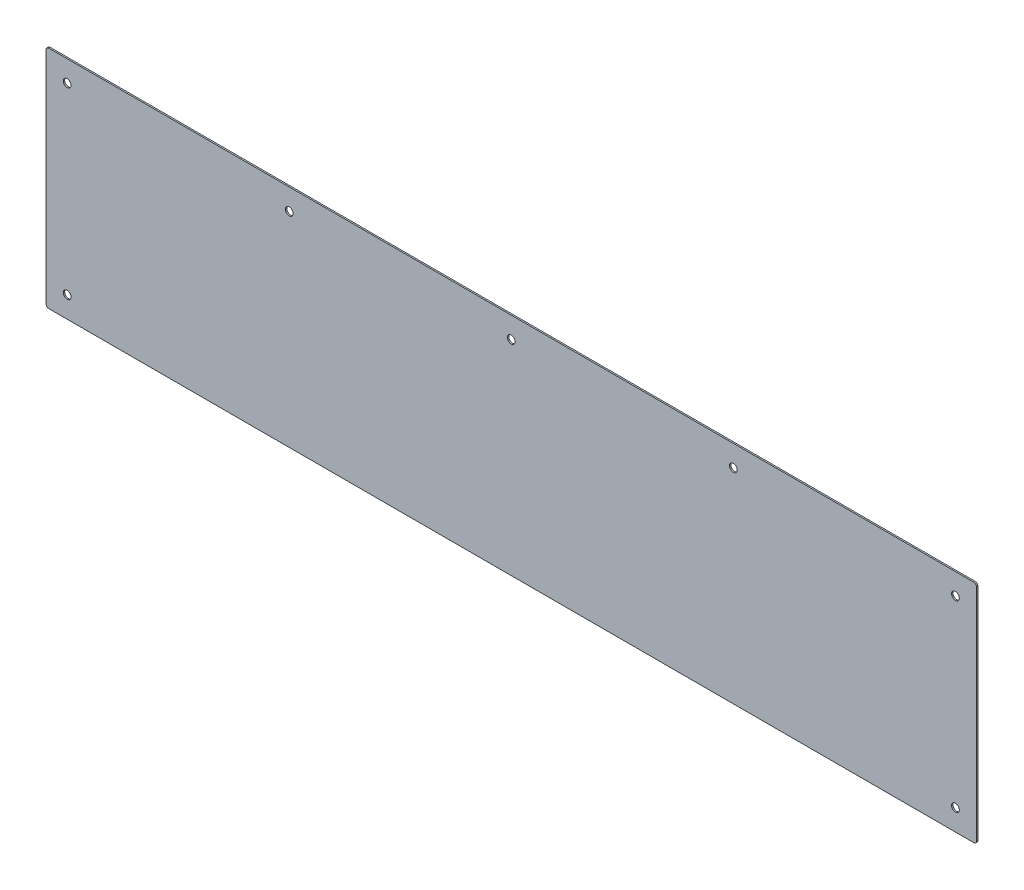
ISO-10303-21;
HEADER;
FILE_DESCRIPTION(('STEP AP214'),'2;1');
FILE_NAME('part.step','',(''),(''),'','','');
FILE_SCHEMA(('AUTOMOTIVE_DESIGN { 1 0 10303 214 1 1 1 1 }'));
ENDSEC;
DATA;
#1=APPLICATION_CONTEXT('core data for automotive mechanical design processes');
#2=APPLICATION_PROTOCOL_DEFINITION('international standard','automotive_design',2000,#1);
#3=PRODUCT_CONTEXT('',#1,'mechanical');
#4=PRODUCT('Part','Part','',(#3));
#5=PRODUCT_RELATED_PRODUCT_CATEGORY('part','',(#4));
#6=PRODUCT_DEFINITION_FORMATION('','',#4);
#7=PRODUCT_DEFINITION_CONTEXT('part definition',#1,'design');
#8=PRODUCT_DEFINITION('design','',#6,#7);
#9=PRODUCT_DEFINITION_SHAPE('','',#8);
#10=(LENGTH_UNIT() NAMED_UNIT(*) SI_UNIT(.MILLI.,.METRE.));
#11=(NAMED_UNIT(*) PLANE_ANGLE_UNIT() SI_UNIT($,.RADIAN.));
#12=(NAMED_UNIT(*) SI_UNIT($,.STERADIAN.) SOLID_ANGLE_UNIT());
#13=UNCERTAINTY_MEASURE_WITH_UNIT(LENGTH_MEASURE(1.E-05),#10,'distance_accuracy_value','');
#14=(GEOMETRIC_REPRESENTATION_CONTEXT(3) GLOBAL_UNCERTAINTY_ASSIGNED_CONTEXT((#13)) GLOBAL_UNIT_ASSIGNED_CONTEXT((#10,
#11,#12)) REPRESENTATION_CONTEXT('',''));
#15=CARTESIAN_POINT('',(0.,0.,0.));
#16=DIRECTION('',(0.,0.,1.));
#17=DIRECTION('',(1.,0.,0.));
#18=AXIS2_PLACEMENT_3D('',#15,#16,#17);
#19=CARTESIAN_POINT('',(-330.,-80.,-1.));
#20=DIRECTION('',(-1.,0.,0.));
#21=DIRECTION('',(0.,0.,1.));
#22=AXIS2_PLACEMENT_3D('',#19,#20,#21);
#23=PLANE('',#22);
#24=DIRECTION('',(0.,-1.,0.));
#25=VECTOR('',#24,1.);
#26=CARTESIAN_POINT('',(-330.,-80.,-1.));
#27=LINE('',#26,#25);
#28=CARTESIAN_POINT('',(-330.,78.,-1.));
#29=VERTEX_POINT('',#28);
#30=CARTESIAN_POINT('',(-330.,-78.,-1.));
#31=VERTEX_POINT('',#30);
#32=EDGE_CURVE('E187',#29,#31,#27,.T.);
#33=ORIENTED_EDGE('',*,*,#32,.T.);
#34=DIRECTION('',(0.,0.,1.));
#35=VECTOR('',#34,1.);
#36=CARTESIAN_POINT('',(-330.,-78.,-1.));
#37=LINE('',#36,#35);
#38=CARTESIAN_POINT('',(-330.,-78.,0.));
#39=VERTEX_POINT('',#38);
#40=EDGE_CURVE('E11',#31,#39,#37,.T.);
#41=ORIENTED_EDGE('',*,*,#40,.T.);
#42=DIRECTION('',(0.,-1.,0.));
#43=VECTOR('',#42,1.);
#44=CARTESIAN_POINT('',(-330.,-80.,0.));
#45=LINE('',#44,#43);
#46=CARTESIAN_POINT('',(-330.,78.,0.));
#47=VERTEX_POINT('',#46);
#48=EDGE_CURVE('E118',#47,#39,#45,.T.);
#49=ORIENTED_EDGE('',*,*,#48,.F.);
#50=DIRECTION('',(0.,0.,1.));
#51=VECTOR('',#50,1.);
#52=CARTESIAN_POINT('',(-330.,78.,-1.));
#53=LINE('',#52,#51);
#54=EDGE_CURVE('E54',#47,#29,#53,.F.);
#55=ORIENTED_EDGE('',*,*,#54,.T.);
#56=EDGE_LOOP('',(#33,#41,#49,#55));
#57=FACE_BOUND('',#56,.T.);
#58=ADVANCED_FACE('F45',(#57),#23,.T.);
#59=CARTESIAN_POINT('',(330.,80.,-1.));
#60=DIRECTION('',(0.,1.,0.));
#61=DIRECTION('',(-1.,0.,0.));
#62=AXIS2_PLACEMENT_3D('',#59,#60,#61);
#63=PLANE('',#62);
#64=DIRECTION('',(-1.,0.,0.));
#65=VECTOR('',#64,1.);
#66=CARTESIAN_POINT('',(330.,80.,0.));
#67=LINE('',#66,#65);
#68=CARTESIAN_POINT('',(328.,80.,0.));
#69=VERTEX_POINT('',#68);
#70=CARTESIAN_POINT('',(-328.,80.,0.));
#71=VERTEX_POINT('',#70);
#72=EDGE_CURVE('E151',#69,#71,#67,.T.);
#73=ORIENTED_EDGE('',*,*,#72,.F.);
#74=DIRECTION('',(0.,0.,1.));
#75=VECTOR('',#74,1.);
#76=CARTESIAN_POINT('',(328.,80.,-1.));
#77=LINE('',#76,#75);
#78=CARTESIAN_POINT('',(328.,80.,-1.));
#79=VERTEX_POINT('',#78);
#80=EDGE_CURVE('E68',#69,#79,#77,.F.);
#81=ORIENTED_EDGE('',*,*,#80,.T.);
#82=DIRECTION('',(-1.,0.,0.));
#83=VECTOR('',#82,1.);
#84=CARTESIAN_POINT('',(330.,80.,-1.));
#85=LINE('',#84,#83);
#86=CARTESIAN_POINT('',(-328.,80.,-1.));
#87=VERTEX_POINT('',#86);
#88=EDGE_CURVE('E141',#79,#87,#85,.T.);
#89=ORIENTED_EDGE('',*,*,#88,.T.);
#90=DIRECTION('',(0.,0.,1.));
#91=VECTOR('',#90,1.);
#92=CARTESIAN_POINT('',(-328.,80.,-1.));
#93=LINE('',#92,#91);
#94=EDGE_CURVE('E177',#87,#71,#93,.T.);
#95=ORIENTED_EDGE('',*,*,#94,.T.);
#96=EDGE_LOOP('',(#73,#81,#89,#95));
#97=FACE_BOUND('',#96,.T.);
#98=ADVANCED_FACE('F196',(#97),#63,.T.);
#99=CARTESIAN_POINT('',(330.,-80.,-1.));
#100=DIRECTION('',(1.,0.,0.));
#101=DIRECTION('',(0.,0.,-1.));
#102=AXIS2_PLACEMENT_3D('',#99,#100,#101);
#103=PLANE('',#102);
#104=DIRECTION('',(0.,1.,0.));
#105=VECTOR('',#104,1.);
#106=CARTESIAN_POINT('',(330.,-80.,0.));
#107=LINE('',#106,#105);
#108=CARTESIAN_POINT('',(330.,-78.,0.));
#109=VERTEX_POINT('',#108);
#110=CARTESIAN_POINT('',(330.,78.,0.));
#111=VERTEX_POINT('',#110);
#112=EDGE_CURVE('E135',#109,#111,#107,.T.);
#113=ORIENTED_EDGE('',*,*,#112,.F.);
#114=DIRECTION('',(0.,0.,1.));
#115=VECTOR('',#114,1.);
#116=CARTESIAN_POINT('',(330.,-78.,-1.));
#117=LINE('',#116,#115);
#118=CARTESIAN_POINT('',(330.,-78.,-1.));
#119=VERTEX_POINT('',#118);
#120=EDGE_CURVE('E165',#109,#119,#117,.F.);
#121=ORIENTED_EDGE('',*,*,#120,.T.);
#122=DIRECTION('',(0.,1.,0.));
#123=VECTOR('',#122,1.);
#124=CARTESIAN_POINT('',(330.,-80.,-1.));
#125=LINE('',#124,#123);
#126=CARTESIAN_POINT('',(330.,78.,-1.));
#127=VERTEX_POINT('',#126);
#128=EDGE_CURVE('E148',#119,#127,#125,.T.);
#129=ORIENTED_EDGE('',*,*,#128,.T.);
#130=DIRECTION('',(0.,0.,1.));
#131=VECTOR('',#130,1.);
#132=CARTESIAN_POINT('',(330.,78.,-1.));
#133=LINE('',#132,#131);
#134=EDGE_CURVE('E161',#127,#111,#133,.T.);
#135=ORIENTED_EDGE('',*,*,#134,.T.);
#136=EDGE_LOOP('',(#113,#121,#129,#135));
#137=FACE_BOUND('',#136,.T.);
#138=ADVANCED_FACE('F304',(#137),#103,.T.);
#139=CARTESIAN_POINT('',(330.,-80.,-1.));
#140=DIRECTION('',(0.,-1.,0.));
#141=DIRECTION('',(1.,0.,0.));
#142=AXIS2_PLACEMENT_3D('',#139,#140,#141);
#143=PLANE('',#142);
#144=DIRECTION('',(1.,0.,0.));
#145=VECTOR('',#144,1.);
#146=CARTESIAN_POINT('',(330.,-80.,-1.));
#147=LINE('',#146,#145);
#148=CARTESIAN_POINT('',(-328.,-80.,-1.));
#149=VERTEX_POINT('',#148);
#150=CARTESIAN_POINT('',(328.,-80.,-1.));
#151=VERTEX_POINT('',#150);
#152=EDGE_CURVE('E192',#149,#151,#147,.T.);
#153=ORIENTED_EDGE('',*,*,#152,.T.);
#154=DIRECTION('',(0.,0.,1.));
#155=VECTOR('',#154,1.);
#156=CARTESIAN_POINT('',(328.,-80.,-1.));
#157=LINE('',#156,#155);
#158=CARTESIAN_POINT('',(328.,-80.,0.));
#159=VERTEX_POINT('',#158);
#160=EDGE_CURVE('E133',#151,#159,#157,.T.);
#161=ORIENTED_EDGE('',*,*,#160,.T.);
#162=DIRECTION('',(1.,0.,0.));
#163=VECTOR('',#162,1.);
#164=CARTESIAN_POINT('',(330.,-80.,0.));
#165=LINE('',#164,#163);
#166=CARTESIAN_POINT('',(-328.,-80.,0.));
#167=VERTEX_POINT('',#166);
#168=EDGE_CURVE('E116',#167,#159,#165,.T.);
#169=ORIENTED_EDGE('',*,*,#168,.F.);
#170=DIRECTION('',(0.,0.,1.));
#171=VECTOR('',#170,1.);
#172=CARTESIAN_POINT('',(-328.,-80.,-1.));
#173=LINE('',#172,#171);
#174=EDGE_CURVE('E130',#167,#149,#173,.F.);
#175=ORIENTED_EDGE('',*,*,#174,.T.);
#176=EDGE_LOOP('',(#153,#161,#169,#175));
#177=FACE_BOUND('',#176,.T.);
#178=ADVANCED_FACE('F129',(#177),#143,.T.);
#179=CARTESIAN_POINT('',(0.,0.,-1.));
#180=DIRECTION('',(0.,0.,1.));
#181=DIRECTION('',(1.,0.,0.));
#182=AXIS2_PLACEMENT_3D('',#179,#180,#181);
#183=PLANE('',#182);
#184=CARTESIAN_POINT('',(-315.,64.9999999999999,-1.));
#185=DIRECTION('',(0.,0.,1.));
#186=DIRECTION('',(1.,0.,0.));
#187=AXIS2_PLACEMENT_3D('',#184,#185,#186);
#188=CIRCLE('',#187,2.74999999999997);
#189=CARTESIAN_POINT('',(-312.25,64.9999999999999,-1.));
#190=VERTEX_POINT('',#189);
#191=EDGE_CURVE('E259',#190,#190,#188,.T.);
#192=ORIENTED_EDGE('',*,*,#191,.T.);
#193=EDGE_LOOP('',(#192));
#194=FACE_BOUND('',#193,.T.);
#195=CARTESIAN_POINT('',(-315.,-64.9999999999999,-1.));
#196=DIRECTION('',(0.,0.,1.));
#197=DIRECTION('',(1.,0.,0.));
#198=AXIS2_PLACEMENT_3D('',#195,#196,#197);
#199=CIRCLE('',#198,2.74999999999997);
#200=CARTESIAN_POINT('',(-312.25,-64.9999999999999,-1.));
#201=VERTEX_POINT('',#200);
#202=EDGE_CURVE('E251',#201,#201,#199,.T.);
#203=ORIENTED_EDGE('',*,*,#202,.T.);
#204=EDGE_LOOP('',(#203));
#205=FACE_BOUND('',#204,.T.);
#206=CARTESIAN_POINT('',(315.,-64.9999999999999,-1.));
#207=DIRECTION('',(0.,0.,1.));
#208=DIRECTION('',(1.,0.,0.));
#209=AXIS2_PLACEMENT_3D('',#206,#207,#208);
#210=CIRCLE('',#209,2.74999999999997);
#211=CARTESIAN_POINT('',(317.75,-64.9999999999999,-1.));
#212=VERTEX_POINT('',#211);
#213=EDGE_CURVE('E243',#212,#212,#210,.T.);
#214=ORIENTED_EDGE('',*,*,#213,.T.);
#215=EDGE_LOOP('',(#214));
#216=FACE_BOUND('',#215,.T.);
#217=CARTESIAN_POINT('',(315.,64.9999999999999,-1.));
#218=DIRECTION('',(0.,0.,1.));
#219=DIRECTION('',(1.,0.,0.));
#220=AXIS2_PLACEMENT_3D('',#217,#218,#219);
#221=CIRCLE('',#220,2.74999999999997);
#222=CARTESIAN_POINT('',(317.75,64.9999999999999,-1.));
#223=VERTEX_POINT('',#222);
#224=EDGE_CURVE('E235',#223,#223,#221,.T.);
#225=ORIENTED_EDGE('',*,*,#224,.T.);
#226=EDGE_LOOP('',(#225));
#227=FACE_BOUND('',#226,.T.);
#228=CARTESIAN_POINT('',(-157.5,64.9999999999999,-1.));
#229=DIRECTION('',(0.,0.,1.));
#230=DIRECTION('',(1.,0.,0.));
#231=AXIS2_PLACEMENT_3D('',#228,#229,#230);
#232=CIRCLE('',#231,2.75);
#233=CARTESIAN_POINT('',(-154.75,64.9999999999999,-1.));
#234=VERTEX_POINT('',#233);
#235=EDGE_CURVE('E227',#234,#234,#232,.T.);
#236=ORIENTED_EDGE('',*,*,#235,.T.);
#237=EDGE_LOOP('',(#236));
#238=FACE_BOUND('',#237,.T.);
#239=CARTESIAN_POINT('',(157.5,64.9999999999999,-1.));
#240=DIRECTION('',(0.,0.,1.));
#241=DIRECTION('',(1.,0.,0.));
#242=AXIS2_PLACEMENT_3D('',#239,#240,#241);
#243=CIRCLE('',#242,2.75);
#244=CARTESIAN_POINT('',(160.25,64.9999999999999,-1.));
#245=VERTEX_POINT('',#244);
#246=EDGE_CURVE('E219',#245,#245,#243,.T.);
#247=ORIENTED_EDGE('',*,*,#246,.T.);
#248=EDGE_LOOP('',(#247));
#249=FACE_BOUND('',#248,.T.);
#250=CARTESIAN_POINT('',(0.,64.9999999999999,-1.));
#251=DIRECTION('',(0.,0.,1.));
#252=DIRECTION('',(1.,0.,0.));
#253=AXIS2_PLACEMENT_3D('',#250,#251,#252);
#254=CIRCLE('',#253,2.75);
#255=CARTESIAN_POINT('',(2.75,64.9999999999999,-1.));
#256=VERTEX_POINT('',#255);
#257=EDGE_CURVE('E206',#256,#256,#254,.T.);
#258=ORIENTED_EDGE('',*,*,#257,.T.);
#259=EDGE_LOOP('',(#258));
#260=FACE_BOUND('',#259,.T.);
#261=ORIENTED_EDGE('',*,*,#128,.F.);
#262=CARTESIAN_POINT('',(328.,-78.,-1.));
#263=DIRECTION('',(0.,0.,1.));
#264=DIRECTION('',(1.,0.,0.));
#265=AXIS2_PLACEMENT_3D('',#262,#263,#264);
#266=CIRCLE('',#265,2.);
#267=EDGE_CURVE('E174',#119,#151,#266,.F.);
#268=ORIENTED_EDGE('',*,*,#267,.T.);
#269=ORIENTED_EDGE('',*,*,#152,.F.);
#270=CARTESIAN_POINT('',(-328.,-78.,-1.));
#271=DIRECTION('',(0.,0.,1.));
#272=DIRECTION('',(1.,0.,0.));
#273=AXIS2_PLACEMENT_3D('',#270,#271,#272);
#274=CIRCLE('',#273,2.);
#275=EDGE_CURVE('E139',#149,#31,#274,.F.);
#276=ORIENTED_EDGE('',*,*,#275,.T.);
#277=ORIENTED_EDGE('',*,*,#32,.F.);
#278=CARTESIAN_POINT('',(-328.,78.,-1.));
#279=DIRECTION('',(0.,0.,1.));
#280=DIRECTION('',(1.,0.,0.));
#281=AXIS2_PLACEMENT_3D('',#278,#279,#280);
#282=CIRCLE('',#281,2.);
#283=EDGE_CURVE('E61',#29,#87,#282,.F.);
#284=ORIENTED_EDGE('',*,*,#283,.T.);
#285=ORIENTED_EDGE('',*,*,#88,.F.);
#286=CARTESIAN_POINT('',(328.,78.,-1.));
#287=DIRECTION('',(0.,0.,1.));
#288=DIRECTION('',(1.,0.,0.));
#289=AXIS2_PLACEMENT_3D('',#286,#287,#288);
#290=CIRCLE('',#289,2.);
#291=EDGE_CURVE('E171',#79,#127,#290,.F.);
#292=ORIENTED_EDGE('',*,*,#291,.T.);
#293=EDGE_LOOP('',(#261,#268,#269,#276,#277,#284,#285,#292));
#294=FACE_BOUND('',#293,.T.);
#295=ADVANCED_FACE('F190',(#194,#205,#216,#227,#238,#249,#260,#294),#183,.F.);
#296=CARTESIAN_POINT('',(0.,0.,0.));
#297=DIRECTION('',(0.,0.,1.));
#298=DIRECTION('',(1.,0.,0.));
#299=AXIS2_PLACEMENT_3D('',#296,#297,#298);
#300=PLANE('',#299);
#301=CARTESIAN_POINT('',(-315.,64.9999999999999,0.));
#302=DIRECTION('',(0.,0.,1.));
#303=DIRECTION('',(1.,0.,0.));
#304=AXIS2_PLACEMENT_3D('',#301,#302,#303);
#305=CIRCLE('',#304,2.74999999999997);
#306=CARTESIAN_POINT('',(-312.25,64.9999999999999,0.));
#307=VERTEX_POINT('',#306);
#308=EDGE_CURVE('E263',#307,#307,#305,.T.);
#309=ORIENTED_EDGE('',*,*,#308,.F.);
#310=EDGE_LOOP('',(#309));
#311=FACE_BOUND('',#310,.T.);
#312=CARTESIAN_POINT('',(-315.,-64.9999999999999,0.));
#313=DIRECTION('',(0.,0.,1.));
#314=DIRECTION('',(1.,0.,0.));
#315=AXIS2_PLACEMENT_3D('',#312,#313,#314);
#316=CIRCLE('',#315,2.74999999999997);
#317=CARTESIAN_POINT('',(-312.25,-64.9999999999999,0.));
#318=VERTEX_POINT('',#317);
#319=EDGE_CURVE('E255',#318,#318,#316,.T.);
#320=ORIENTED_EDGE('',*,*,#319,.F.);
#321=EDGE_LOOP('',(#320));
#322=FACE_BOUND('',#321,.T.);
#323=CARTESIAN_POINT('',(315.,-64.9999999999999,0.));
#324=DIRECTION('',(0.,0.,1.));
#325=DIRECTION('',(1.,0.,0.));
#326=AXIS2_PLACEMENT_3D('',#323,#324,#325);
#327=CIRCLE('',#326,2.74999999999997);
#328=CARTESIAN_POINT('',(317.75,-64.9999999999999,0.));
#329=VERTEX_POINT('',#328);
#330=EDGE_CURVE('E247',#329,#329,#327,.T.);
#331=ORIENTED_EDGE('',*,*,#330,.F.);
#332=EDGE_LOOP('',(#331));
#333=FACE_BOUND('',#332,.T.);
#334=CARTESIAN_POINT('',(315.,64.9999999999999,0.));
#335=DIRECTION('',(0.,0.,1.));
#336=DIRECTION('',(1.,0.,0.));
#337=AXIS2_PLACEMENT_3D('',#334,#335,#336);
#338=CIRCLE('',#337,2.74999999999997);
#339=CARTESIAN_POINT('',(317.75,64.9999999999999,0.));
#340=VERTEX_POINT('',#339);
#341=EDGE_CURVE('E239',#340,#340,#338,.T.);
#342=ORIENTED_EDGE('',*,*,#341,.F.);
#343=EDGE_LOOP('',(#342));
#344=FACE_BOUND('',#343,.T.);
#345=CARTESIAN_POINT('',(-157.5,64.9999999999999,0.));
#346=DIRECTION('',(0.,0.,1.));
#347=DIRECTION('',(1.,0.,0.));
#348=AXIS2_PLACEMENT_3D('',#345,#346,#347);
#349=CIRCLE('',#348,2.75);
#350=CARTESIAN_POINT('',(-154.75,64.9999999999999,0.));
#351=VERTEX_POINT('',#350);
#352=EDGE_CURVE('E231',#351,#351,#349,.T.);
#353=ORIENTED_EDGE('',*,*,#352,.F.);
#354=EDGE_LOOP('',(#353));
#355=FACE_BOUND('',#354,.T.);
#356=CARTESIAN_POINT('',(157.5,64.9999999999999,0.));
#357=DIRECTION('',(0.,0.,1.));
#358=DIRECTION('',(1.,0.,0.));
#359=AXIS2_PLACEMENT_3D('',#356,#357,#358);
#360=CIRCLE('',#359,2.75);
#361=CARTESIAN_POINT('',(160.25,64.9999999999999,0.));
#362=VERTEX_POINT('',#361);
#363=EDGE_CURVE('E223',#362,#362,#360,.T.);
#364=ORIENTED_EDGE('',*,*,#363,.F.);
#365=EDGE_LOOP('',(#364));
#366=FACE_BOUND('',#365,.T.);
#367=CARTESIAN_POINT('',(0.,64.9999999999999,0.));
#368=DIRECTION('',(0.,0.,1.));
#369=DIRECTION('',(1.,0.,0.));
#370=AXIS2_PLACEMENT_3D('',#367,#368,#369);
#371=CIRCLE('',#370,2.75);
#372=CARTESIAN_POINT('',(2.75,64.9999999999999,0.));
#373=VERTEX_POINT('',#372);
#374=EDGE_CURVE('E215',#373,#373,#371,.T.);
#375=ORIENTED_EDGE('',*,*,#374,.F.);
#376=EDGE_LOOP('',(#375));
#377=FACE_BOUND('',#376,.T.);
#378=ORIENTED_EDGE('',*,*,#168,.T.);
#379=CARTESIAN_POINT('',(328.,-78.,0.));
#380=DIRECTION('',(0.,0.,1.));
#381=DIRECTION('',(1.,0.,0.));
#382=AXIS2_PLACEMENT_3D('',#379,#380,#381);
#383=CIRCLE('',#382,2.);
#384=EDGE_CURVE('E158',#159,#109,#383,.T.);
#385=ORIENTED_EDGE('',*,*,#384,.T.);
#386=ORIENTED_EDGE('',*,*,#112,.T.);
#387=CARTESIAN_POINT('',(328.,78.,0.));
#388=DIRECTION('',(0.,0.,1.));
#389=DIRECTION('',(1.,0.,0.));
#390=AXIS2_PLACEMENT_3D('',#387,#388,#389);
#391=CIRCLE('',#390,2.);
#392=EDGE_CURVE('E123',#111,#69,#391,.T.);
#393=ORIENTED_EDGE('',*,*,#392,.T.);
#394=ORIENTED_EDGE('',*,*,#72,.T.);
#395=CARTESIAN_POINT('',(-328.,78.,0.));
#396=DIRECTION('',(0.,0.,1.));
#397=DIRECTION('',(1.,0.,0.));
#398=AXIS2_PLACEMENT_3D('',#395,#396,#397);
#399=CIRCLE('',#398,2.);
#400=EDGE_CURVE('E124',#71,#47,#399,.T.);
#401=ORIENTED_EDGE('',*,*,#400,.T.);
#402=ORIENTED_EDGE('',*,*,#48,.T.);
#403=CARTESIAN_POINT('',(-328.,-78.,0.));
#404=DIRECTION('',(0.,0.,1.));
#405=DIRECTION('',(1.,0.,0.));
#406=AXIS2_PLACEMENT_3D('',#403,#404,#405);
#407=CIRCLE('',#406,2.);
#408=EDGE_CURVE('E113',#39,#167,#407,.T.);
#409=ORIENTED_EDGE('',*,*,#408,.T.);
#410=EDGE_LOOP('',(#378,#385,#386,#393,#394,#401,#402,#409));
#411=FACE_BOUND('',#410,.T.);
#412=ADVANCED_FACE('F115',(#311,#322,#333,#344,#355,#366,#377,#411),#300,.T.);
#413=CARTESIAN_POINT('',(0.,64.9999999999999,0.));
#414=DIRECTION('',(0.,0.,1.));
#415=DIRECTION('',(1.,0.,0.));
#416=AXIS2_PLACEMENT_3D('',#413,#414,#415);
#417=CYLINDRICAL_SURFACE('',#416,2.75);
#418=ORIENTED_EDGE('',*,*,#257,.F.);
#419=EDGE_LOOP('',(#418));
#420=FACE_BOUND('',#419,.T.);
#421=ORIENTED_EDGE('',*,*,#374,.T.);
#422=EDGE_LOOP('',(#421));
#423=FACE_BOUND('',#422,.T.);
#424=ADVANCED_FACE('F273',(#420,#423),#417,.F.);
#425=CARTESIAN_POINT('',(157.5,64.9999999999999,0.));
#426=DIRECTION('',(0.,0.,1.));
#427=DIRECTION('',(1.,0.,0.));
#428=AXIS2_PLACEMENT_3D('',#425,#426,#427);
#429=CYLINDRICAL_SURFACE('',#428,2.75);
#430=ORIENTED_EDGE('',*,*,#246,.F.);
#431=EDGE_LOOP('',(#430));
#432=FACE_BOUND('',#431,.T.);
#433=ORIENTED_EDGE('',*,*,#363,.T.);
#434=EDGE_LOOP('',(#433));
#435=FACE_BOUND('',#434,.T.);
#436=ADVANCED_FACE('F288',(#432,#435),#429,.F.);
#437=CARTESIAN_POINT('',(-157.5,64.9999999999999,0.));
#438=DIRECTION('',(0.,0.,1.));
#439=DIRECTION('',(1.,0.,0.));
#440=AXIS2_PLACEMENT_3D('',#437,#438,#439);
#441=CYLINDRICAL_SURFACE('',#440,2.75);
#442=ORIENTED_EDGE('',*,*,#235,.F.);
#443=EDGE_LOOP('',(#442));
#444=FACE_BOUND('',#443,.T.);
#445=ORIENTED_EDGE('',*,*,#352,.T.);
#446=EDGE_LOOP('',(#445));
#447=FACE_BOUND('',#446,.T.);
#448=ADVANCED_FACE('F294',(#444,#447),#441,.F.);
#449=CARTESIAN_POINT('',(315.,64.9999999999999,0.));
#450=DIRECTION('',(0.,0.,1.));
#451=DIRECTION('',(1.,0.,0.));
#452=AXIS2_PLACEMENT_3D('',#449,#450,#451);
#453=CYLINDRICAL_SURFACE('',#452,2.74999999999997);
#454=ORIENTED_EDGE('',*,*,#224,.F.);
#455=EDGE_LOOP('',(#454));
#456=FACE_BOUND('',#455,.T.);
#457=ORIENTED_EDGE('',*,*,#341,.T.);
#458=EDGE_LOOP('',(#457));
#459=FACE_BOUND('',#458,.T.);
#460=ADVANCED_FACE('F419',(#456,#459),#453,.F.);
#461=CARTESIAN_POINT('',(315.,-64.9999999999999,0.));
#462=DIRECTION('',(0.,0.,1.));
#463=DIRECTION('',(1.,0.,0.));
#464=AXIS2_PLACEMENT_3D('',#461,#462,#463);
#465=CYLINDRICAL_SURFACE('',#464,2.74999999999997);
#466=ORIENTED_EDGE('',*,*,#213,.F.);
#467=EDGE_LOOP('',(#466));
#468=FACE_BOUND('',#467,.T.);
#469=ORIENTED_EDGE('',*,*,#330,.T.);
#470=EDGE_LOOP('',(#469));
#471=FACE_BOUND('',#470,.T.);
#472=ADVANCED_FACE('F408',(#468,#471),#465,.F.);
#473=CARTESIAN_POINT('',(-315.,-64.9999999999999,0.));
#474=DIRECTION('',(0.,0.,1.));
#475=DIRECTION('',(1.,0.,0.));
#476=AXIS2_PLACEMENT_3D('',#473,#474,#475);
#477=CYLINDRICAL_SURFACE('',#476,2.74999999999997);
#478=ORIENTED_EDGE('',*,*,#202,.F.);
#479=EDGE_LOOP('',(#478));
#480=FACE_BOUND('',#479,.T.);
#481=ORIENTED_EDGE('',*,*,#319,.T.);
#482=EDGE_LOOP('',(#481));
#483=FACE_BOUND('',#482,.T.);
#484=ADVANCED_FACE('F397',(#480,#483),#477,.F.);
#485=CARTESIAN_POINT('',(-315.,64.9999999999999,0.));
#486=DIRECTION('',(0.,0.,1.));
#487=DIRECTION('',(1.,0.,0.));
#488=AXIS2_PLACEMENT_3D('',#485,#486,#487);
#489=CYLINDRICAL_SURFACE('',#488,2.74999999999997);
#490=ORIENTED_EDGE('',*,*,#191,.F.);
#491=EDGE_LOOP('',(#490));
#492=FACE_BOUND('',#491,.T.);
#493=ORIENTED_EDGE('',*,*,#308,.T.);
#494=EDGE_LOOP('',(#493));
#495=FACE_BOUND('',#494,.T.);
#496=ADVANCED_FACE('F269',(#492,#495),#489,.F.);
#497=CARTESIAN_POINT('',(328.,-78.,-1.));
#498=DIRECTION('',(0.,0.,1.));
#499=DIRECTION('',(1.,0.,0.));
#500=AXIS2_PLACEMENT_3D('',#497,#498,#499);
#501=CYLINDRICAL_SURFACE('',#500,2.);
#502=ORIENTED_EDGE('',*,*,#267,.F.);
#503=ORIENTED_EDGE('',*,*,#120,.F.);
#504=ORIENTED_EDGE('',*,*,#384,.F.);
#505=ORIENTED_EDGE('',*,*,#160,.F.);
#506=EDGE_LOOP('',(#502,#503,#504,#505));
#507=FACE_BOUND('',#506,.T.);
#508=ADVANCED_FACE('F309',(#507),#501,.T.);
#509=CARTESIAN_POINT('',(328.,78.,-1.));
#510=DIRECTION('',(0.,0.,1.));
#511=DIRECTION('',(1.,0.,0.));
#512=AXIS2_PLACEMENT_3D('',#509,#510,#511);
#513=CYLINDRICAL_SURFACE('',#512,2.);
#514=ORIENTED_EDGE('',*,*,#291,.F.);
#515=ORIENTED_EDGE('',*,*,#80,.F.);
#516=ORIENTED_EDGE('',*,*,#392,.F.);
#517=ORIENTED_EDGE('',*,*,#134,.F.);
#518=EDGE_LOOP('',(#514,#515,#516,#517));
#519=FACE_BOUND('',#518,.T.);
#520=ADVANCED_FACE('F312',(#519),#513,.T.);
#521=CARTESIAN_POINT('',(-328.,-78.,-1.));
#522=DIRECTION('',(0.,0.,1.));
#523=DIRECTION('',(1.,0.,0.));
#524=AXIS2_PLACEMENT_3D('',#521,#522,#523);
#525=CYLINDRICAL_SURFACE('',#524,2.);
#526=ORIENTED_EDGE('',*,*,#275,.F.);
#527=ORIENTED_EDGE('',*,*,#174,.F.);
#528=ORIENTED_EDGE('',*,*,#408,.F.);
#529=ORIENTED_EDGE('',*,*,#40,.F.);
#530=EDGE_LOOP('',(#526,#527,#528,#529));
#531=FACE_BOUND('',#530,.T.);
#532=ADVANCED_FACE('F138',(#531),#525,.T.);
#533=CARTESIAN_POINT('',(-328.,78.,-1.));
#534=DIRECTION('',(0.,0.,1.));
#535=DIRECTION('',(1.,0.,0.));
#536=AXIS2_PLACEMENT_3D('',#533,#534,#535);
#537=CYLINDRICAL_SURFACE('',#536,2.);
#538=ORIENTED_EDGE('',*,*,#283,.F.);
#539=ORIENTED_EDGE('',*,*,#54,.F.);
#540=ORIENTED_EDGE('',*,*,#400,.F.);
#541=ORIENTED_EDGE('',*,*,#94,.F.);
#542=EDGE_LOOP('',(#538,#539,#540,#541));
#543=FACE_BOUND('',#542,.T.);
#544=ADVANCED_FACE('F47',(#543),#537,.T.);
#545=CLOSED_SHELL('',(#58,#98,#138,#178,#295,#412,#424,#436,#448,#460,#472,#484,#496,#508,#520,
#532,#544));
#546=MANIFOLD_SOLID_BREP('B2',#545);
#547=ADVANCED_BREP_SHAPE_REPRESENTATION('',(#18,#546),#14);
#548=SHAPE_DEFINITION_REPRESENTATION(#9,#547);
ENDSEC;
END-ISO-10303-21;
